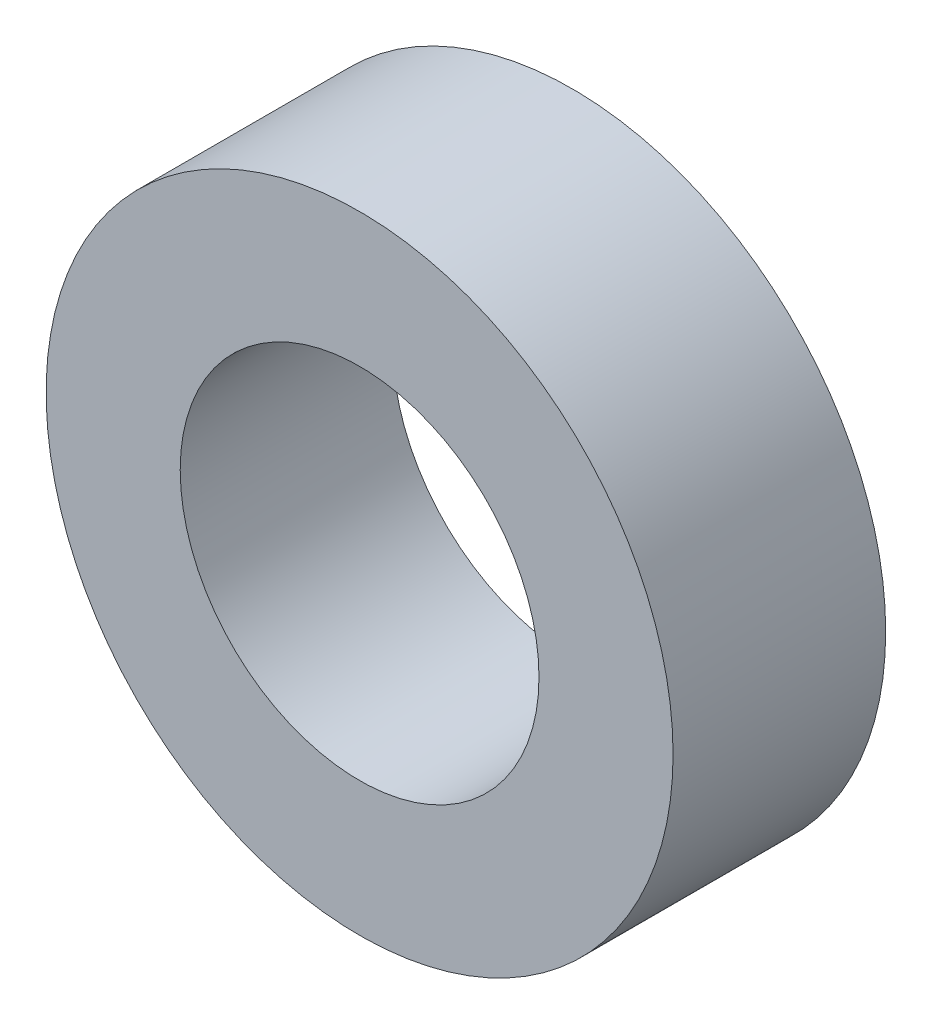
ISO-10303-21;
HEADER;
FILE_DESCRIPTION(('STEP AP214'),'2;1');
FILE_NAME('part.step','',(''),(''),'','','');
FILE_SCHEMA(('AUTOMOTIVE_DESIGN { 1 0 10303 214 1 1 1 1 }'));
ENDSEC;
DATA;
#1=APPLICATION_CONTEXT('core data for automotive mechanical design processes');
#2=APPLICATION_PROTOCOL_DEFINITION('international standard','automotive_design',2000,#1);
#3=PRODUCT_CONTEXT('',#1,'mechanical');
#4=PRODUCT('Part','Part','',(#3));
#5=PRODUCT_RELATED_PRODUCT_CATEGORY('part','',(#4));
#6=PRODUCT_DEFINITION_FORMATION('','',#4);
#7=PRODUCT_DEFINITION_CONTEXT('part definition',#1,'design');
#8=PRODUCT_DEFINITION('design','',#6,#7);
#9=PRODUCT_DEFINITION_SHAPE('','',#8);
#10=(LENGTH_UNIT() NAMED_UNIT(*) SI_UNIT(.MILLI.,.METRE.));
#11=(NAMED_UNIT(*) PLANE_ANGLE_UNIT() SI_UNIT($,.RADIAN.));
#12=(NAMED_UNIT(*) SI_UNIT($,.STERADIAN.) SOLID_ANGLE_UNIT());
#13=UNCERTAINTY_MEASURE_WITH_UNIT(LENGTH_MEASURE(1.E-05),#10,'distance_accuracy_value','');
#14=(GEOMETRIC_REPRESENTATION_CONTEXT(3) GLOBAL_UNCERTAINTY_ASSIGNED_CONTEXT((#13)) GLOBAL_UNIT_ASSIGNED_CONTEXT((#10,
#11,#12)) REPRESENTATION_CONTEXT('',''));
#15=CARTESIAN_POINT('',(0.,0.,0.));
#16=DIRECTION('',(0.,0.,1.));
#17=DIRECTION('',(1.,0.,0.));
#18=AXIS2_PLACEMENT_3D('',#15,#16,#17);
#19=CARTESIAN_POINT('',(0.,0.,16.));
#20=DIRECTION('',(0.,0.,1.));
#21=DIRECTION('',(1.,0.,0.));
#22=AXIS2_PLACEMENT_3D('',#19,#20,#21);
#23=PLANE('',#22);
#24=CARTESIAN_POINT('',(0.,0.,16.));
#25=DIRECTION('',(0.,0.,1.));
#26=DIRECTION('',(1.,0.,0.));
#27=AXIS2_PLACEMENT_3D('',#24,#25,#26);
#28=CIRCLE('',#27,23.59);
#29=CARTESIAN_POINT('',(23.59,0.,16.));
#30=VERTEX_POINT('',#29);
#31=EDGE_CURVE('E10',#30,#30,#28,.T.);
#32=ORIENTED_EDGE('',*,*,#31,.T.);
#33=EDGE_LOOP('',(#32));
#34=FACE_BOUND('',#33,.T.);
#35=CARTESIAN_POINT('',(0.,0.,16.));
#36=DIRECTION('',(0.,0.,1.));
#37=DIRECTION('',(1.,0.,0.));
#38=AXIS2_PLACEMENT_3D('',#35,#36,#37);
#39=CIRCLE('',#38,13.5);
#40=CARTESIAN_POINT('',(13.5,0.,16.));
#41=VERTEX_POINT('',#40);
#42=EDGE_CURVE('E50',#41,#41,#39,.T.);
#43=ORIENTED_EDGE('',*,*,#42,.F.);
#44=EDGE_LOOP('',(#43));
#45=FACE_BOUND('',#44,.T.);
#46=ADVANCED_FACE('F37',(#34,#45),#23,.T.);
#47=CARTESIAN_POINT('',(0.,0.,0.));
#48=DIRECTION('',(0.,0.,1.));
#49=DIRECTION('',(1.,0.,0.));
#50=AXIS2_PLACEMENT_3D('',#47,#48,#49);
#51=PLANE('',#50);
#52=CARTESIAN_POINT('',(0.,0.,0.));
#53=DIRECTION('',(0.,0.,1.));
#54=DIRECTION('',(1.,0.,0.));
#55=AXIS2_PLACEMENT_3D('',#52,#53,#54);
#56=CIRCLE('',#55,23.59);
#57=CARTESIAN_POINT('',(23.59,0.,0.));
#58=VERTEX_POINT('',#57);
#59=EDGE_CURVE('E41',#58,#58,#56,.T.);
#60=ORIENTED_EDGE('',*,*,#59,.F.);
#61=EDGE_LOOP('',(#60));
#62=FACE_BOUND('',#61,.T.);
#63=CARTESIAN_POINT('',(0.,0.,0.));
#64=DIRECTION('',(0.,0.,1.));
#65=DIRECTION('',(1.,0.,0.));
#66=AXIS2_PLACEMENT_3D('',#63,#64,#65);
#67=CIRCLE('',#66,13.5);
#68=CARTESIAN_POINT('',(13.5,0.,0.));
#69=VERTEX_POINT('',#68);
#70=EDGE_CURVE('E52',#69,#69,#67,.T.);
#71=ORIENTED_EDGE('',*,*,#70,.T.);
#72=EDGE_LOOP('',(#71));
#73=FACE_BOUND('',#72,.T.);
#74=ADVANCED_FACE('F64',(#62,#73),#51,.F.);
#75=CARTESIAN_POINT('',(0.,0.,16.));
#76=DIRECTION('',(0.,0.,-1.));
#77=DIRECTION('',(-1.,0.,0.));
#78=AXIS2_PLACEMENT_3D('',#75,#76,#77);
#79=CYLINDRICAL_SURFACE('',#78,23.59);
#80=ORIENTED_EDGE('',*,*,#31,.F.);
#81=EDGE_LOOP('',(#80));
#82=FACE_BOUND('',#81,.T.);
#83=ORIENTED_EDGE('',*,*,#59,.T.);
#84=EDGE_LOOP('',(#83));
#85=FACE_BOUND('',#84,.T.);
#86=ADVANCED_FACE('F39',(#82,#85),#79,.T.);
#87=CARTESIAN_POINT('',(0.,0.,16.));
#88=DIRECTION('',(0.,0.,-1.));
#89=DIRECTION('',(-1.,0.,0.));
#90=AXIS2_PLACEMENT_3D('',#87,#88,#89);
#91=CYLINDRICAL_SURFACE('',#90,13.5);
#92=ORIENTED_EDGE('',*,*,#42,.T.);
#93=EDGE_LOOP('',(#92));
#94=FACE_BOUND('',#93,.T.);
#95=ORIENTED_EDGE('',*,*,#70,.F.);
#96=EDGE_LOOP('',(#95));
#97=FACE_BOUND('',#96,.T.);
#98=ADVANCED_FACE('F60',(#94,#97),#91,.F.);
#99=CLOSED_SHELL('',(#46,#74,#86,#98));
#100=MANIFOLD_SOLID_BREP('B2',#99);
#101=ADVANCED_BREP_SHAPE_REPRESENTATION('',(#18,#100),#14);
#102=SHAPE_DEFINITION_REPRESENTATION(#9,#101);
ENDSEC;
END-ISO-10303-21;
